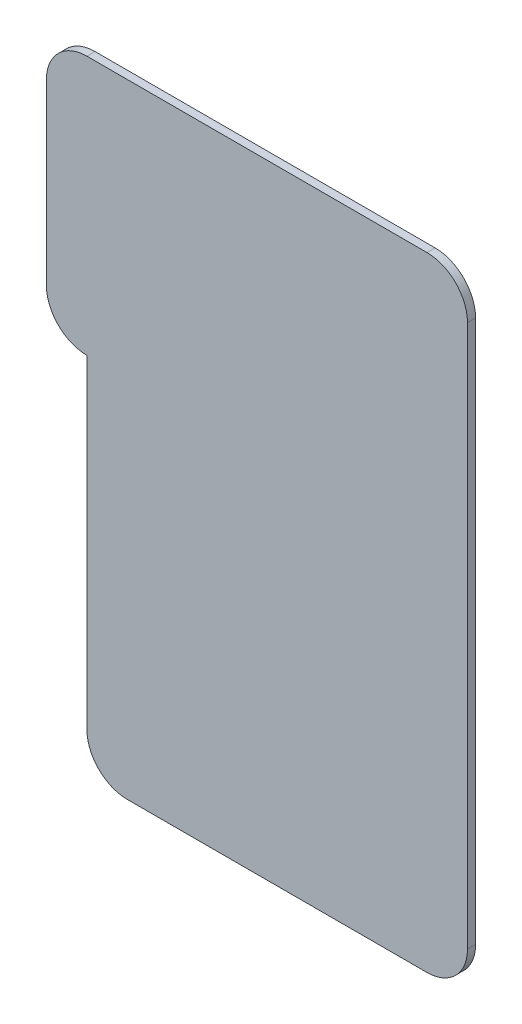
ISO-10303-21;
HEADER;
FILE_DESCRIPTION(('STEP AP214'),'2;1');
FILE_NAME('part.step','',(''),(''),'','','');
FILE_SCHEMA(('AUTOMOTIVE_DESIGN { 1 0 10303 214 1 1 1 1 }'));
ENDSEC;
DATA;
#1=APPLICATION_CONTEXT('core data for automotive mechanical design processes');
#2=APPLICATION_PROTOCOL_DEFINITION('international standard','automotive_design',2000,#1);
#3=PRODUCT_CONTEXT('',#1,'mechanical');
#4=PRODUCT('Part','Part','',(#3));
#5=PRODUCT_RELATED_PRODUCT_CATEGORY('part','',(#4));
#6=PRODUCT_DEFINITION_FORMATION('','',#4);
#7=PRODUCT_DEFINITION_CONTEXT('part definition',#1,'design');
#8=PRODUCT_DEFINITION('design','',#6,#7);
#9=PRODUCT_DEFINITION_SHAPE('','',#8);
#10=(LENGTH_UNIT() NAMED_UNIT(*) SI_UNIT(.MILLI.,.METRE.));
#11=(NAMED_UNIT(*) PLANE_ANGLE_UNIT() SI_UNIT($,.RADIAN.));
#12=(NAMED_UNIT(*) SI_UNIT($,.STERADIAN.) SOLID_ANGLE_UNIT());
#13=UNCERTAINTY_MEASURE_WITH_UNIT(LENGTH_MEASURE(1.E-05),#10,'distance_accuracy_value','');
#14=(GEOMETRIC_REPRESENTATION_CONTEXT(3) GLOBAL_UNCERTAINTY_ASSIGNED_CONTEXT((#13)) GLOBAL_UNIT_ASSIGNED_CONTEXT((#10,
#11,#12)) REPRESENTATION_CONTEXT('',''));
#15=CARTESIAN_POINT('',(0.,0.,0.));
#16=DIRECTION('',(0.,0.,1.));
#17=DIRECTION('',(1.,0.,0.));
#18=AXIS2_PLACEMENT_3D('',#15,#16,#17);
#19=CARTESIAN_POINT('',(-75.,15.,-2.));
#20=DIRECTION('',(-1.,0.,0.));
#21=DIRECTION('',(0.,0.,1.));
#22=AXIS2_PLACEMENT_3D('',#19,#20,#21);
#23=PLANE('',#22);
#24=DIRECTION('',(0.,-1.,0.));
#25=VECTOR('',#24,1.);
#26=CARTESIAN_POINT('',(-75.,15.,-2.));
#27=LINE('',#26,#25);
#28=CARTESIAN_POINT('',(-75.,69.,-2.));
#29=VERTEX_POINT('',#28);
#30=CARTESIAN_POINT('',(-75.,25.,-2.));
#31=VERTEX_POINT('',#30);
#32=EDGE_CURVE('E133',#29,#31,#27,.T.);
#33=ORIENTED_EDGE('',*,*,#32,.T.);
#34=DIRECTION('',(0.,0.,1.));
#35=VECTOR('',#34,1.);
#36=CARTESIAN_POINT('',(-75.,25.,-2.));
#37=LINE('',#36,#35);
#38=CARTESIAN_POINT('',(-75.,25.,0.));
#39=VERTEX_POINT('',#38);
#40=EDGE_CURVE('E138',#31,#39,#37,.T.);
#41=ORIENTED_EDGE('',*,*,#40,.T.);
#42=DIRECTION('',(0.,-1.,0.));
#43=VECTOR('',#42,1.);
#44=CARTESIAN_POINT('',(-75.,15.,0.));
#45=LINE('',#44,#43);
#46=CARTESIAN_POINT('',(-75.,69.,0.));
#47=VERTEX_POINT('',#46);
#48=EDGE_CURVE('E232',#47,#39,#45,.T.);
#49=ORIENTED_EDGE('',*,*,#48,.F.);
#50=DIRECTION('',(0.,0.,1.));
#51=VECTOR('',#50,1.);
#52=CARTESIAN_POINT('',(-75.,69.,-2.));
#53=LINE('',#52,#51);
#54=EDGE_CURVE('E125',#47,#29,#53,.F.);
#55=ORIENTED_EDGE('',*,*,#54,.T.);
#56=EDGE_LOOP('',(#33,#41,#49,#55));
#57=FACE_BOUND('',#56,.T.);
#58=ADVANCED_FACE('F38',(#57),#23,.T.);
#59=CARTESIAN_POINT('',(29.,79.,-2.));
#60=DIRECTION('',(0.,1.,0.));
#61=DIRECTION('',(-1.,0.,0.));
#62=AXIS2_PLACEMENT_3D('',#59,#60,#61);
#63=PLANE('',#62);
#64=DIRECTION('',(-1.,0.,0.));
#65=VECTOR('',#64,1.);
#66=CARTESIAN_POINT('',(29.,79.,0.));
#67=LINE('',#66,#65);
#68=CARTESIAN_POINT('',(19.,79.,0.));
#69=VERTEX_POINT('',#68);
#70=CARTESIAN_POINT('',(-64.9999999999999,79.,0.));
#71=VERTEX_POINT('',#70);
#72=EDGE_CURVE('E161',#69,#71,#67,.T.);
#73=ORIENTED_EDGE('',*,*,#72,.F.);
#74=DIRECTION('',(0.,0.,1.));
#75=VECTOR('',#74,1.);
#76=CARTESIAN_POINT('',(19.,79.,-2.));
#77=LINE('',#76,#75);
#78=CARTESIAN_POINT('',(19.,79.,-2.));
#79=VERTEX_POINT('',#78);
#80=EDGE_CURVE('E11',#69,#79,#77,.F.);
#81=ORIENTED_EDGE('',*,*,#80,.T.);
#82=DIRECTION('',(-1.,0.,0.));
#83=VECTOR('',#82,1.);
#84=CARTESIAN_POINT('',(29.,79.,-2.));
#85=LINE('',#84,#83);
#86=CARTESIAN_POINT('',(-64.9999999999999,79.,-2.));
#87=VERTEX_POINT('',#86);
#88=EDGE_CURVE('E126',#79,#87,#85,.T.);
#89=ORIENTED_EDGE('',*,*,#88,.T.);
#90=DIRECTION('',(0.,0.,1.));
#91=VECTOR('',#90,1.);
#92=CARTESIAN_POINT('',(-65.,79.,-2.));
#93=LINE('',#92,#91);
#94=EDGE_CURVE('E46',#87,#71,#93,.T.);
#95=ORIENTED_EDGE('',*,*,#94,.T.);
#96=EDGE_LOOP('',(#73,#81,#89,#95));
#97=FACE_BOUND('',#96,.T.);
#98=ADVANCED_FACE('F160',(#97),#63,.T.);
#99=CARTESIAN_POINT('',(29.,-75.,-2.));
#100=DIRECTION('',(1.,0.,0.));
#101=DIRECTION('',(0.,0.,-1.));
#102=AXIS2_PLACEMENT_3D('',#99,#100,#101);
#103=PLANE('',#102);
#104=DIRECTION('',(0.,1.,0.));
#105=VECTOR('',#104,1.);
#106=CARTESIAN_POINT('',(29.,-75.,0.));
#107=LINE('',#106,#105);
#108=CARTESIAN_POINT('',(29.,-65.,0.));
#109=VERTEX_POINT('',#108);
#110=CARTESIAN_POINT('',(29.,69.,0.));
#111=VERTEX_POINT('',#110);
#112=EDGE_CURVE('E173',#109,#111,#107,.T.);
#113=ORIENTED_EDGE('',*,*,#112,.F.);
#114=DIRECTION('',(0.,0.,1.));
#115=VECTOR('',#114,1.);
#116=CARTESIAN_POINT('',(29.,-65.,-2.));
#117=LINE('',#116,#115);
#118=CARTESIAN_POINT('',(29.,-65.,-2.));
#119=VERTEX_POINT('',#118);
#120=EDGE_CURVE('E153',#109,#119,#117,.F.);
#121=ORIENTED_EDGE('',*,*,#120,.T.);
#122=DIRECTION('',(0.,1.,0.));
#123=VECTOR('',#122,1.);
#124=CARTESIAN_POINT('',(29.,-75.,-2.));
#125=LINE('',#124,#123);
#126=CARTESIAN_POINT('',(29.,69.,-2.));
#127=VERTEX_POINT('',#126);
#128=EDGE_CURVE('E195',#119,#127,#125,.T.);
#129=ORIENTED_EDGE('',*,*,#128,.T.);
#130=DIRECTION('',(0.,0.,1.));
#131=VECTOR('',#130,1.);
#132=CARTESIAN_POINT('',(29.,69.,-2.));
#133=LINE('',#132,#131);
#134=EDGE_CURVE('E150',#127,#111,#133,.T.);
#135=ORIENTED_EDGE('',*,*,#134,.T.);
#136=EDGE_LOOP('',(#113,#121,#129,#135));
#137=FACE_BOUND('',#136,.T.);
#138=ADVANCED_FACE('F200',(#137),#103,.T.);
#139=CARTESIAN_POINT('',(29.,-75.,-2.));
#140=DIRECTION('',(0.,-1.,0.));
#141=DIRECTION('',(1.,0.,0.));
#142=AXIS2_PLACEMENT_3D('',#139,#140,#141);
#143=PLANE('',#142);
#144=DIRECTION('',(1.,0.,0.));
#145=VECTOR('',#144,1.);
#146=CARTESIAN_POINT('',(29.,-75.,0.));
#147=LINE('',#146,#145);
#148=CARTESIAN_POINT('',(-55.,-75.,0.));
#149=VERTEX_POINT('',#148);
#150=CARTESIAN_POINT('',(19.,-75.,0.));
#151=VERTEX_POINT('',#150);
#152=EDGE_CURVE('E176',#149,#151,#147,.T.);
#153=ORIENTED_EDGE('',*,*,#152,.F.);
#154=DIRECTION('',(0.,0.,1.));
#155=VECTOR('',#154,1.);
#156=CARTESIAN_POINT('',(-55.,-75.,-2.));
#157=LINE('',#156,#155);
#158=CARTESIAN_POINT('',(-55.,-75.,-2.));
#159=VERTEX_POINT('',#158);
#160=EDGE_CURVE('E148',#149,#159,#157,.F.);
#161=ORIENTED_EDGE('',*,*,#160,.T.);
#162=DIRECTION('',(1.,0.,0.));
#163=VECTOR('',#162,1.);
#164=CARTESIAN_POINT('',(29.,-75.,-2.));
#165=LINE('',#164,#163);
#166=CARTESIAN_POINT('',(19.,-75.,-2.));
#167=VERTEX_POINT('',#166);
#168=EDGE_CURVE('E132',#159,#167,#165,.T.);
#169=ORIENTED_EDGE('',*,*,#168,.T.);
#170=DIRECTION('',(0.,0.,1.));
#171=VECTOR('',#170,1.);
#172=CARTESIAN_POINT('',(19.,-75.,-2.));
#173=LINE('',#172,#171);
#174=EDGE_CURVE('E141',#167,#151,#173,.T.);
#175=ORIENTED_EDGE('',*,*,#174,.T.);
#176=EDGE_LOOP('',(#153,#161,#169,#175));
#177=FACE_BOUND('',#176,.T.);
#178=ADVANCED_FACE('F239',(#177),#143,.T.);
#179=CARTESIAN_POINT('',(-65.,-75.,-2.));
#180=DIRECTION('',(-1.,0.,0.));
#181=DIRECTION('',(0.,-1.,0.));
#182=AXIS2_PLACEMENT_3D('',#179,#180,#181);
#183=PLANE('',#182);
#184=DIRECTION('',(0.,-1.,0.));
#185=VECTOR('',#184,1.);
#186=CARTESIAN_POINT('',(-65.,-75.,-2.));
#187=LINE('',#186,#185);
#188=CARTESIAN_POINT('',(-64.9999999999999,15.,-2.));
#189=VERTEX_POINT('',#188);
#190=CARTESIAN_POINT('',(-65.,-65.,-2.));
#191=VERTEX_POINT('',#190);
#192=EDGE_CURVE('E119',#189,#191,#187,.T.);
#193=ORIENTED_EDGE('',*,*,#192,.T.);
#194=DIRECTION('',(0.,0.,1.));
#195=VECTOR('',#194,1.);
#196=CARTESIAN_POINT('',(-65.,-65.,-2.));
#197=LINE('',#196,#195);
#198=CARTESIAN_POINT('',(-65.,-65.,0.));
#199=VERTEX_POINT('',#198);
#200=EDGE_CURVE('E139',#191,#199,#197,.T.);
#201=ORIENTED_EDGE('',*,*,#200,.T.);
#202=DIRECTION('',(0.,-1.,0.));
#203=VECTOR('',#202,1.);
#204=CARTESIAN_POINT('',(-65.,-75.,0.));
#205=LINE('',#204,#203);
#206=CARTESIAN_POINT('',(-64.9999999999999,15.,0.));
#207=VERTEX_POINT('',#206);
#208=EDGE_CURVE('E122',#207,#199,#205,.T.);
#209=ORIENTED_EDGE('',*,*,#208,.F.);
#210=DIRECTION('',(0.,0.,1.));
#211=VECTOR('',#210,1.);
#212=CARTESIAN_POINT('',(-64.9999999999999,15.,-2.));
#213=LINE('',#212,#211);
#214=EDGE_CURVE('E116',#189,#207,#213,.T.);
#215=ORIENTED_EDGE('',*,*,#214,.F.);
#216=EDGE_LOOP('',(#193,#201,#209,#215));
#217=FACE_BOUND('',#216,.T.);
#218=ADVANCED_FACE('F117',(#217),#183,.T.);
#219=CARTESIAN_POINT('',(0.,0.,-2.));
#220=DIRECTION('',(0.,0.,1.));
#221=DIRECTION('',(1.,0.,0.));
#222=AXIS2_PLACEMENT_3D('',#219,#220,#221);
#223=PLANE('',#222);
#224=ORIENTED_EDGE('',*,*,#192,.F.);
#225=CARTESIAN_POINT('',(-65.,25.,-2.));
#226=DIRECTION('',(0.,0.,1.));
#227=DIRECTION('',(1.,0.,0.));
#228=AXIS2_PLACEMENT_3D('',#225,#226,#227);
#229=CIRCLE('',#228,10.);
#230=EDGE_CURVE('E130',#189,#31,#229,.F.);
#231=ORIENTED_EDGE('',*,*,#230,.T.);
#232=ORIENTED_EDGE('',*,*,#32,.F.);
#233=CARTESIAN_POINT('',(-65.,69.,-2.));
#234=DIRECTION('',(0.,0.,1.));
#235=DIRECTION('',(1.,0.,0.));
#236=AXIS2_PLACEMENT_3D('',#233,#234,#235);
#237=CIRCLE('',#236,10.);
#238=EDGE_CURVE('E190',#29,#87,#237,.F.);
#239=ORIENTED_EDGE('',*,*,#238,.T.);
#240=ORIENTED_EDGE('',*,*,#88,.F.);
#241=CARTESIAN_POINT('',(19.,69.,-2.));
#242=DIRECTION('',(0.,0.,1.));
#243=DIRECTION('',(1.,0.,0.));
#244=AXIS2_PLACEMENT_3D('',#241,#242,#243);
#245=CIRCLE('',#244,10.);
#246=EDGE_CURVE('E192',#79,#127,#245,.F.);
#247=ORIENTED_EDGE('',*,*,#246,.T.);
#248=ORIENTED_EDGE('',*,*,#128,.F.);
#249=CARTESIAN_POINT('',(19.,-65.,-2.));
#250=DIRECTION('',(0.,0.,1.));
#251=DIRECTION('',(1.,0.,0.));
#252=AXIS2_PLACEMENT_3D('',#249,#250,#251);
#253=CIRCLE('',#252,10.);
#254=EDGE_CURVE('E59',#119,#167,#253,.F.);
#255=ORIENTED_EDGE('',*,*,#254,.T.);
#256=ORIENTED_EDGE('',*,*,#168,.F.);
#257=CARTESIAN_POINT('',(-55.,-65.,-2.));
#258=DIRECTION('',(0.,0.,1.));
#259=DIRECTION('',(1.,0.,0.));
#260=AXIS2_PLACEMENT_3D('',#257,#258,#259);
#261=CIRCLE('',#260,10.);
#262=EDGE_CURVE('E53',#159,#191,#261,.F.);
#263=ORIENTED_EDGE('',*,*,#262,.T.);
#264=EDGE_LOOP('',(#224,#231,#232,#239,#240,#247,#248,#255,#256,#263));
#265=FACE_BOUND('',#264,.T.);
#266=ADVANCED_FACE('F128',(#265),#223,.F.);
#267=CARTESIAN_POINT('',(0.,0.,0.));
#268=DIRECTION('',(0.,0.,1.));
#269=DIRECTION('',(1.,0.,0.));
#270=AXIS2_PLACEMENT_3D('',#267,#268,#269);
#271=PLANE('',#270);
#272=ORIENTED_EDGE('',*,*,#48,.T.);
#273=CARTESIAN_POINT('',(-65.,25.,0.));
#274=DIRECTION('',(0.,0.,1.));
#275=DIRECTION('',(1.,0.,0.));
#276=AXIS2_PLACEMENT_3D('',#273,#274,#275);
#277=CIRCLE('',#276,10.);
#278=EDGE_CURVE('E188',#39,#207,#277,.T.);
#279=ORIENTED_EDGE('',*,*,#278,.T.);
#280=ORIENTED_EDGE('',*,*,#208,.T.);
#281=CARTESIAN_POINT('',(-55.,-65.,0.));
#282=DIRECTION('',(0.,0.,1.));
#283=DIRECTION('',(1.,0.,0.));
#284=AXIS2_PLACEMENT_3D('',#281,#282,#283);
#285=CIRCLE('',#284,10.);
#286=EDGE_CURVE('E186',#199,#149,#285,.T.);
#287=ORIENTED_EDGE('',*,*,#286,.T.);
#288=ORIENTED_EDGE('',*,*,#152,.T.);
#289=CARTESIAN_POINT('',(19.,-65.,0.));
#290=DIRECTION('',(0.,0.,1.));
#291=DIRECTION('',(1.,0.,0.));
#292=AXIS2_PLACEMENT_3D('',#289,#290,#291);
#293=CIRCLE('',#292,10.);
#294=EDGE_CURVE('E184',#151,#109,#293,.T.);
#295=ORIENTED_EDGE('',*,*,#294,.T.);
#296=ORIENTED_EDGE('',*,*,#112,.T.);
#297=CARTESIAN_POINT('',(19.,69.,0.));
#298=DIRECTION('',(0.,0.,1.));
#299=DIRECTION('',(1.,0.,0.));
#300=AXIS2_PLACEMENT_3D('',#297,#298,#299);
#301=CIRCLE('',#300,10.);
#302=EDGE_CURVE('E172',#111,#69,#301,.T.);
#303=ORIENTED_EDGE('',*,*,#302,.T.);
#304=ORIENTED_EDGE('',*,*,#72,.T.);
#305=CARTESIAN_POINT('',(-65.,69.,0.));
#306=DIRECTION('',(0.,0.,1.));
#307=DIRECTION('',(1.,0.,0.));
#308=AXIS2_PLACEMENT_3D('',#305,#306,#307);
#309=CIRCLE('',#308,10.);
#310=EDGE_CURVE('E169',#71,#47,#309,.T.);
#311=ORIENTED_EDGE('',*,*,#310,.T.);
#312=EDGE_LOOP('',(#272,#279,#280,#287,#288,#295,#296,#303,#304,#311));
#313=FACE_BOUND('',#312,.T.);
#314=ADVANCED_FACE('F168',(#313),#271,.T.);
#315=CARTESIAN_POINT('',(-65.,25.,-2.));
#316=DIRECTION('',(0.,0.,1.));
#317=DIRECTION('',(1.,0.,0.));
#318=AXIS2_PLACEMENT_3D('',#315,#316,#317);
#319=CYLINDRICAL_SURFACE('',#318,10.);
#320=ORIENTED_EDGE('',*,*,#230,.F.);
#321=ORIENTED_EDGE('',*,*,#214,.T.);
#322=ORIENTED_EDGE('',*,*,#278,.F.);
#323=ORIENTED_EDGE('',*,*,#40,.F.);
#324=EDGE_LOOP('',(#320,#321,#322,#323));
#325=FACE_BOUND('',#324,.T.);
#326=ADVANCED_FACE('F136',(#325),#319,.T.);
#327=CARTESIAN_POINT('',(-55.,-65.,-2.));
#328=DIRECTION('',(0.,0.,1.));
#329=DIRECTION('',(1.,0.,0.));
#330=AXIS2_PLACEMENT_3D('',#327,#328,#329);
#331=CYLINDRICAL_SURFACE('',#330,10.);
#332=ORIENTED_EDGE('',*,*,#262,.F.);
#333=ORIENTED_EDGE('',*,*,#160,.F.);
#334=ORIENTED_EDGE('',*,*,#286,.F.);
#335=ORIENTED_EDGE('',*,*,#200,.F.);
#336=EDGE_LOOP('',(#332,#333,#334,#335));
#337=FACE_BOUND('',#336,.T.);
#338=ADVANCED_FACE('F210',(#337),#331,.T.);
#339=CARTESIAN_POINT('',(19.,-65.,-2.));
#340=DIRECTION('',(0.,0.,1.));
#341=DIRECTION('',(1.,0.,0.));
#342=AXIS2_PLACEMENT_3D('',#339,#340,#341);
#343=CYLINDRICAL_SURFACE('',#342,10.);
#344=ORIENTED_EDGE('',*,*,#254,.F.);
#345=ORIENTED_EDGE('',*,*,#120,.F.);
#346=ORIENTED_EDGE('',*,*,#294,.F.);
#347=ORIENTED_EDGE('',*,*,#174,.F.);
#348=EDGE_LOOP('',(#344,#345,#346,#347));
#349=FACE_BOUND('',#348,.T.);
#350=ADVANCED_FACE('F205',(#349),#343,.T.);
#351=CARTESIAN_POINT('',(19.,69.,-2.));
#352=DIRECTION('',(0.,0.,1.));
#353=DIRECTION('',(1.,0.,0.));
#354=AXIS2_PLACEMENT_3D('',#351,#352,#353);
#355=CYLINDRICAL_SURFACE('',#354,10.);
#356=ORIENTED_EDGE('',*,*,#246,.F.);
#357=ORIENTED_EDGE('',*,*,#80,.F.);
#358=ORIENTED_EDGE('',*,*,#302,.F.);
#359=ORIENTED_EDGE('',*,*,#134,.F.);
#360=EDGE_LOOP('',(#356,#357,#358,#359));
#361=FACE_BOUND('',#360,.T.);
#362=ADVANCED_FACE('F203',(#361),#355,.T.);
#363=CARTESIAN_POINT('',(-65.,69.,-2.));
#364=DIRECTION('',(0.,0.,1.));
#365=DIRECTION('',(1.,0.,0.));
#366=AXIS2_PLACEMENT_3D('',#363,#364,#365);
#367=CYLINDRICAL_SURFACE('',#366,10.);
#368=ORIENTED_EDGE('',*,*,#238,.F.);
#369=ORIENTED_EDGE('',*,*,#54,.F.);
#370=ORIENTED_EDGE('',*,*,#310,.F.);
#371=ORIENTED_EDGE('',*,*,#94,.F.);
#372=EDGE_LOOP('',(#368,#369,#370,#371));
#373=FACE_BOUND('',#372,.T.);
#374=ADVANCED_FACE('F40',(#373),#367,.T.);
#375=CLOSED_SHELL('',(#58,#98,#138,#178,#218,#266,#314,#326,#338,#350,#362,#374));
#376=MANIFOLD_SOLID_BREP('B2',#375);
#377=ADVANCED_BREP_SHAPE_REPRESENTATION('',(#18,#376),#14);
#378=SHAPE_DEFINITION_REPRESENTATION(#9,#377);
ENDSEC;
END-ISO-10303-21;
